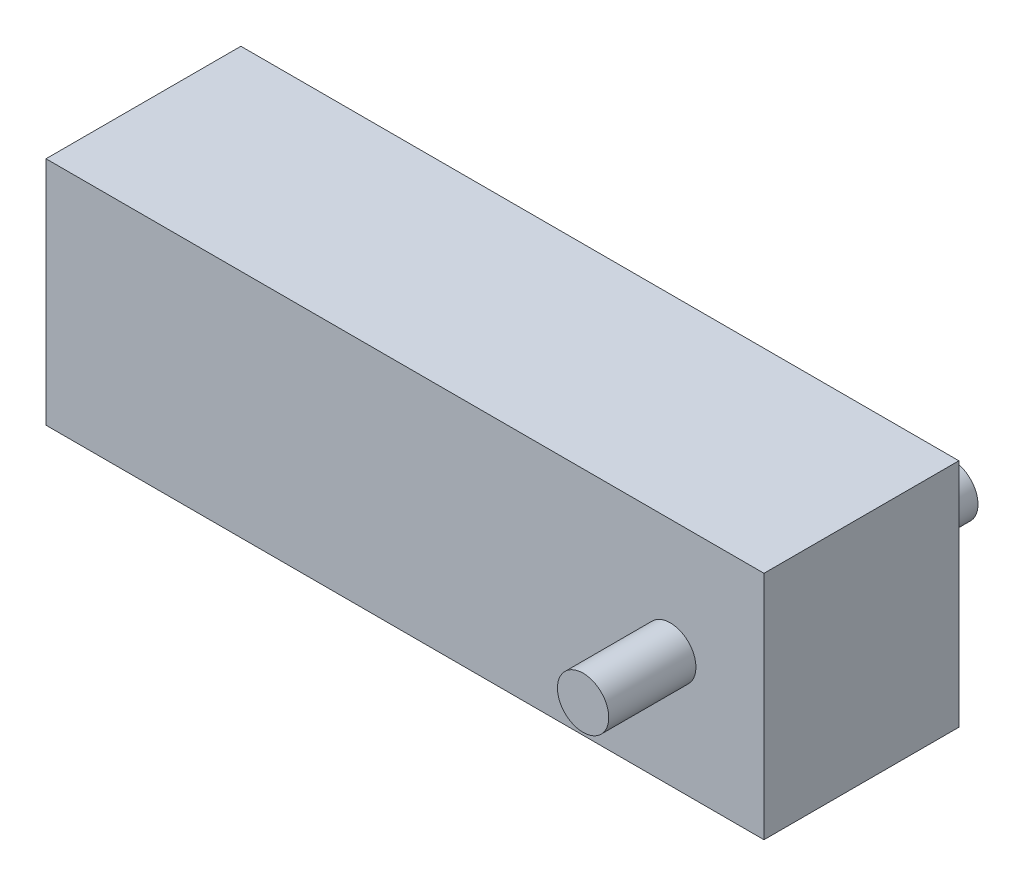
ISO-10303-21;
HEADER;
FILE_DESCRIPTION(('STEP AP214'),'2;1');
FILE_NAME('part.step','',(''),(''),'','','');
FILE_SCHEMA(('AUTOMOTIVE_DESIGN { 1 0 10303 214 1 1 1 1 }'));
ENDSEC;
DATA;
#1=APPLICATION_CONTEXT('core data for automotive mechanical design processes');
#2=APPLICATION_PROTOCOL_DEFINITION('international standard','automotive_design',2000,#1);
#3=PRODUCT_CONTEXT('',#1,'mechanical');
#4=PRODUCT('Part','Part','',(#3));
#5=PRODUCT_RELATED_PRODUCT_CATEGORY('part','',(#4));
#6=PRODUCT_DEFINITION_FORMATION('','',#4);
#7=PRODUCT_DEFINITION_CONTEXT('part definition',#1,'design');
#8=PRODUCT_DEFINITION('design','',#6,#7);
#9=PRODUCT_DEFINITION_SHAPE('','',#8);
#10=(LENGTH_UNIT() NAMED_UNIT(*) SI_UNIT(.MILLI.,.METRE.));
#11=(NAMED_UNIT(*) PLANE_ANGLE_UNIT() SI_UNIT($,.RADIAN.));
#12=(NAMED_UNIT(*) SI_UNIT($,.STERADIAN.) SOLID_ANGLE_UNIT());
#13=UNCERTAINTY_MEASURE_WITH_UNIT(LENGTH_MEASURE(1.E-05),#10,'distance_accuracy_value','');
#14=(GEOMETRIC_REPRESENTATION_CONTEXT(3) GLOBAL_UNCERTAINTY_ASSIGNED_CONTEXT((#13)) GLOBAL_UNIT_ASSIGNED_CONTEXT((#10,
#11,#12)) REPRESENTATION_CONTEXT('',''));
#15=CARTESIAN_POINT('',(0.,0.,0.));
#16=DIRECTION('',(0.,0.,1.));
#17=DIRECTION('',(1.,0.,0.));
#18=AXIS2_PLACEMENT_3D('',#15,#16,#17);
#19=CARTESIAN_POINT('',(-35.,11.25,9.5));
#20=DIRECTION('',(1.,0.,0.));
#21=DIRECTION('',(0.,0.,-1.));
#22=AXIS2_PLACEMENT_3D('',#19,#20,#21);
#23=PLANE('',#22);
#24=DIRECTION('',(0.,-1.,0.));
#25=VECTOR('',#24,1.);
#26=CARTESIAN_POINT('',(-35.,11.25,-9.5));
#27=LINE('',#26,#25);
#28=CARTESIAN_POINT('',(-35.,11.25,-9.5));
#29=VERTEX_POINT('',#28);
#30=CARTESIAN_POINT('',(-35.,-11.25,-9.5));
#31=VERTEX_POINT('',#30);
#32=EDGE_CURVE('E102',#29,#31,#27,.T.);
#33=ORIENTED_EDGE('',*,*,#32,.T.);
#34=DIRECTION('',(0.,0.,-1.));
#35=VECTOR('',#34,1.);
#36=CARTESIAN_POINT('',(-35.,-11.25,9.5));
#37=LINE('',#36,#35);
#38=CARTESIAN_POINT('',(-35.,-11.25,9.5));
#39=VERTEX_POINT('',#38);
#40=EDGE_CURVE('E93',#39,#31,#37,.T.);
#41=ORIENTED_EDGE('',*,*,#40,.F.);
#42=DIRECTION('',(0.,-1.,0.));
#43=VECTOR('',#42,1.);
#44=CARTESIAN_POINT('',(-35.,11.25,9.5));
#45=LINE('',#44,#43);
#46=CARTESIAN_POINT('',(-35.,11.25,9.5));
#47=VERTEX_POINT('',#46);
#48=EDGE_CURVE('E87',#47,#39,#45,.T.);
#49=ORIENTED_EDGE('',*,*,#48,.F.);
#50=DIRECTION('',(0.,0.,-1.));
#51=VECTOR('',#50,1.);
#52=CARTESIAN_POINT('',(-35.,11.25,9.5));
#53=LINE('',#52,#51);
#54=EDGE_CURVE('E98',#47,#29,#53,.T.);
#55=ORIENTED_EDGE('',*,*,#54,.T.);
#56=EDGE_LOOP('',(#33,#41,#49,#55));
#57=FACE_BOUND('',#56,.T.);
#58=ADVANCED_FACE('F35',(#57),#23,.F.);
#59=CARTESIAN_POINT('',(34.9999999999999,-11.25,9.5));
#60=DIRECTION('',(0.,1.,0.));
#61=DIRECTION('',(-1.,0.,0.));
#62=AXIS2_PLACEMENT_3D('',#59,#60,#61);
#63=PLANE('',#62);
#64=DIRECTION('',(1.,0.,0.));
#65=VECTOR('',#64,1.);
#66=CARTESIAN_POINT('',(34.9999999999999,-11.25,-9.5));
#67=LINE('',#66,#65);
#68=CARTESIAN_POINT('',(34.9999999999999,-11.25,-9.5));
#69=VERTEX_POINT('',#68);
#70=EDGE_CURVE('E92',#31,#69,#67,.T.);
#71=ORIENTED_EDGE('',*,*,#70,.T.);
#72=DIRECTION('',(0.,0.,-1.));
#73=VECTOR('',#72,1.);
#74=CARTESIAN_POINT('',(34.9999999999999,-11.25,9.5));
#75=LINE('',#74,#73);
#76=CARTESIAN_POINT('',(34.9999999999999,-11.25,9.5));
#77=VERTEX_POINT('',#76);
#78=EDGE_CURVE('E90',#77,#69,#75,.T.);
#79=ORIENTED_EDGE('',*,*,#78,.F.);
#80=DIRECTION('',(1.,0.,0.));
#81=VECTOR('',#80,1.);
#82=CARTESIAN_POINT('',(34.9999999999999,-11.25,9.5));
#83=LINE('',#82,#81);
#84=EDGE_CURVE('E82',#39,#77,#83,.T.);
#85=ORIENTED_EDGE('',*,*,#84,.F.);
#86=ORIENTED_EDGE('',*,*,#40,.T.);
#87=EDGE_LOOP('',(#71,#79,#85,#86));
#88=FACE_BOUND('',#87,.T.);
#89=ADVANCED_FACE('F91',(#88),#63,.F.);
#90=CARTESIAN_POINT('',(35.,11.25,9.5));
#91=DIRECTION('',(-1.,0.,0.));
#92=DIRECTION('',(0.,-1.,0.));
#93=AXIS2_PLACEMENT_3D('',#90,#91,#92);
#94=PLANE('',#93);
#95=DIRECTION('',(0.,1.,0.));
#96=VECTOR('',#95,1.);
#97=CARTESIAN_POINT('',(35.,11.25,-9.5));
#98=LINE('',#97,#96);
#99=CARTESIAN_POINT('',(35.,11.25,-9.5));
#100=VERTEX_POINT('',#99);
#101=EDGE_CURVE('E68',#69,#100,#98,.T.);
#102=ORIENTED_EDGE('',*,*,#101,.T.);
#103=DIRECTION('',(0.,0.,-1.));
#104=VECTOR('',#103,1.);
#105=CARTESIAN_POINT('',(35.,11.25,9.5));
#106=LINE('',#105,#104);
#107=CARTESIAN_POINT('',(35.,11.25,9.5));
#108=VERTEX_POINT('',#107);
#109=EDGE_CURVE('E94',#108,#100,#106,.T.);
#110=ORIENTED_EDGE('',*,*,#109,.F.);
#111=DIRECTION('',(0.,1.,0.));
#112=VECTOR('',#111,1.);
#113=CARTESIAN_POINT('',(35.,11.25,9.5));
#114=LINE('',#113,#112);
#115=EDGE_CURVE('E85',#77,#108,#114,.T.);
#116=ORIENTED_EDGE('',*,*,#115,.F.);
#117=ORIENTED_EDGE('',*,*,#78,.T.);
#118=EDGE_LOOP('',(#102,#110,#116,#117));
#119=FACE_BOUND('',#118,.T.);
#120=ADVANCED_FACE('F96',(#119),#94,.F.);
#121=CARTESIAN_POINT('',(35.,11.25,9.5));
#122=DIRECTION('',(0.,-1.,0.));
#123=DIRECTION('',(0.,0.,-1.));
#124=AXIS2_PLACEMENT_3D('',#121,#122,#123);
#125=PLANE('',#124);
#126=DIRECTION('',(-1.,0.,0.));
#127=VECTOR('',#126,1.);
#128=CARTESIAN_POINT('',(35.,11.25,-9.5));
#129=LINE('',#128,#127);
#130=EDGE_CURVE('E74',#100,#29,#129,.T.);
#131=ORIENTED_EDGE('',*,*,#130,.T.);
#132=ORIENTED_EDGE('',*,*,#54,.F.);
#133=DIRECTION('',(-1.,0.,0.));
#134=VECTOR('',#133,1.);
#135=CARTESIAN_POINT('',(35.,11.25,9.5));
#136=LINE('',#135,#134);
#137=EDGE_CURVE('E51',#108,#47,#136,.T.);
#138=ORIENTED_EDGE('',*,*,#137,.F.);
#139=ORIENTED_EDGE('',*,*,#109,.T.);
#140=EDGE_LOOP('',(#131,#132,#138,#139));
#141=FACE_BOUND('',#140,.T.);
#142=ADVANCED_FACE('F118',(#141),#125,.F.);
#143=CARTESIAN_POINT('',(0.,0.,9.5));
#144=DIRECTION('',(0.,0.,-1.));
#145=DIRECTION('',(-1.,0.,0.));
#146=AXIS2_PLACEMENT_3D('',#143,#144,#145);
#147=PLANE('',#146);
#148=CARTESIAN_POINT('',(25.8651828662902,0.,9.5));
#149=DIRECTION('',(0.,0.,-1.));
#150=DIRECTION('',(-1.,0.,0.));
#151=AXIS2_PLACEMENT_3D('',#148,#149,#150);
#152=CIRCLE('',#151,2.5);
#153=CARTESIAN_POINT('',(23.3651828662902,0.,9.5));
#154=VERTEX_POINT('',#153);
#155=EDGE_CURVE('E43',#154,#154,#152,.F.);
#156=ORIENTED_EDGE('',*,*,#155,.F.);
#157=EDGE_LOOP('',(#156));
#158=FACE_BOUND('',#157,.T.);
#159=ORIENTED_EDGE('',*,*,#48,.T.);
#160=ORIENTED_EDGE('',*,*,#84,.T.);
#161=ORIENTED_EDGE('',*,*,#115,.T.);
#162=ORIENTED_EDGE('',*,*,#137,.T.);
#163=EDGE_LOOP('',(#159,#160,#161,#162));
#164=FACE_BOUND('',#163,.T.);
#165=ADVANCED_FACE('F83',(#158,#164),#147,.F.);
#166=CARTESIAN_POINT('',(0.,0.,-9.5));
#167=DIRECTION('',(0.,0.,-1.));
#168=DIRECTION('',(-1.,0.,0.));
#169=AXIS2_PLACEMENT_3D('',#166,#167,#168);
#170=PLANE('',#169);
#171=CARTESIAN_POINT('',(25.8651828662902,0.,-9.5));
#172=DIRECTION('',(0.,0.,-1.));
#173=DIRECTION('',(-1.,0.,0.));
#174=AXIS2_PLACEMENT_3D('',#171,#172,#173);
#175=CIRCLE('',#174,2.5);
#176=CARTESIAN_POINT('',(23.3651828662902,0.,-9.5));
#177=VERTEX_POINT('',#176);
#178=EDGE_CURVE('E11',#177,#177,#175,.T.);
#179=ORIENTED_EDGE('',*,*,#178,.F.);
#180=EDGE_LOOP('',(#179));
#181=FACE_BOUND('',#180,.T.);
#182=ORIENTED_EDGE('',*,*,#32,.F.);
#183=ORIENTED_EDGE('',*,*,#130,.F.);
#184=ORIENTED_EDGE('',*,*,#101,.F.);
#185=ORIENTED_EDGE('',*,*,#70,.F.);
#186=EDGE_LOOP('',(#182,#183,#184,#185));
#187=FACE_BOUND('',#186,.T.);
#188=ADVANCED_FACE('F117',(#181,#187),#170,.T.);
#189=CARTESIAN_POINT('',(25.8651828662902,0.,18.));
#190=DIRECTION('',(0.,0.,-1.));
#191=DIRECTION('',(-1.,0.,0.));
#192=AXIS2_PLACEMENT_3D('',#189,#190,#191);
#193=CYLINDRICAL_SURFACE('',#192,2.5);
#194=CARTESIAN_POINT('',(25.8651828662902,0.,18.));
#195=DIRECTION('',(0.,0.,1.));
#196=DIRECTION('',(1.,0.,0.));
#197=AXIS2_PLACEMENT_3D('',#194,#195,#196);
#198=CIRCLE('',#197,2.5);
#199=CARTESIAN_POINT('',(28.3651828662902,0.,18.));
#200=VERTEX_POINT('',#199);
#201=EDGE_CURVE('E105',#200,#200,#198,.T.);
#202=ORIENTED_EDGE('',*,*,#201,.F.);
#203=EDGE_LOOP('',(#202));
#204=FACE_BOUND('',#203,.T.);
#205=ORIENTED_EDGE('',*,*,#155,.T.);
#206=EDGE_LOOP('',(#205));
#207=FACE_BOUND('',#206,.T.);
#208=ADVANCED_FACE('F114',(#204,#207),#193,.T.);
#209=CARTESIAN_POINT('',(25.8651828662902,0.,18.));
#210=DIRECTION('',(0.,0.,1.));
#211=DIRECTION('',(1.,0.,0.));
#212=AXIS2_PLACEMENT_3D('',#209,#210,#211);
#213=PLANE('',#212);
#214=ORIENTED_EDGE('',*,*,#201,.T.);
#215=EDGE_LOOP('',(#214));
#216=FACE_BOUND('',#215,.T.);
#217=ADVANCED_FACE('F151',(#216),#213,.T.);
#218=CARTESIAN_POINT('',(25.8651828662902,0.,-18.));
#219=DIRECTION('',(0.,0.,1.));
#220=DIRECTION('',(1.,0.,0.));
#221=AXIS2_PLACEMENT_3D('',#218,#219,#220);
#222=CYLINDRICAL_SURFACE('',#221,2.5);
#223=CARTESIAN_POINT('',(25.8651828662902,0.,-18.));
#224=DIRECTION('',(0.,0.,1.));
#225=DIRECTION('',(1.,0.,0.));
#226=AXIS2_PLACEMENT_3D('',#223,#224,#225);
#227=CIRCLE('',#226,2.5);
#228=CARTESIAN_POINT('',(28.3651828662902,0.,-18.));
#229=VERTEX_POINT('',#228);
#230=EDGE_CURVE('E138',#229,#229,#227,.T.);
#231=ORIENTED_EDGE('',*,*,#230,.T.);
#232=EDGE_LOOP('',(#231));
#233=FACE_BOUND('',#232,.T.);
#234=ORIENTED_EDGE('',*,*,#178,.T.);
#235=EDGE_LOOP('',(#234));
#236=FACE_BOUND('',#235,.T.);
#237=ADVANCED_FACE('F142',(#233,#236),#222,.T.);
#238=CARTESIAN_POINT('',(25.8651828662902,0.,-18.));
#239=DIRECTION('',(0.,0.,-1.));
#240=DIRECTION('',(1.,0.,0.));
#241=AXIS2_PLACEMENT_3D('',#238,#239,#240);
#242=PLANE('',#241);
#243=ORIENTED_EDGE('',*,*,#230,.F.);
#244=EDGE_LOOP('',(#243));
#245=FACE_BOUND('',#244,.T.);
#246=ADVANCED_FACE('F145',(#245),#242,.T.);
#247=CLOSED_SHELL('',(#58,#89,#120,#142,#165,#188,#208,#217,#237,#246));
#248=MANIFOLD_SOLID_BREP('B2',#247);
#249=ADVANCED_BREP_SHAPE_REPRESENTATION('',(#18,#248),#14);
#250=SHAPE_DEFINITION_REPRESENTATION(#9,#249);
ENDSEC;
END-ISO-10303-21;
